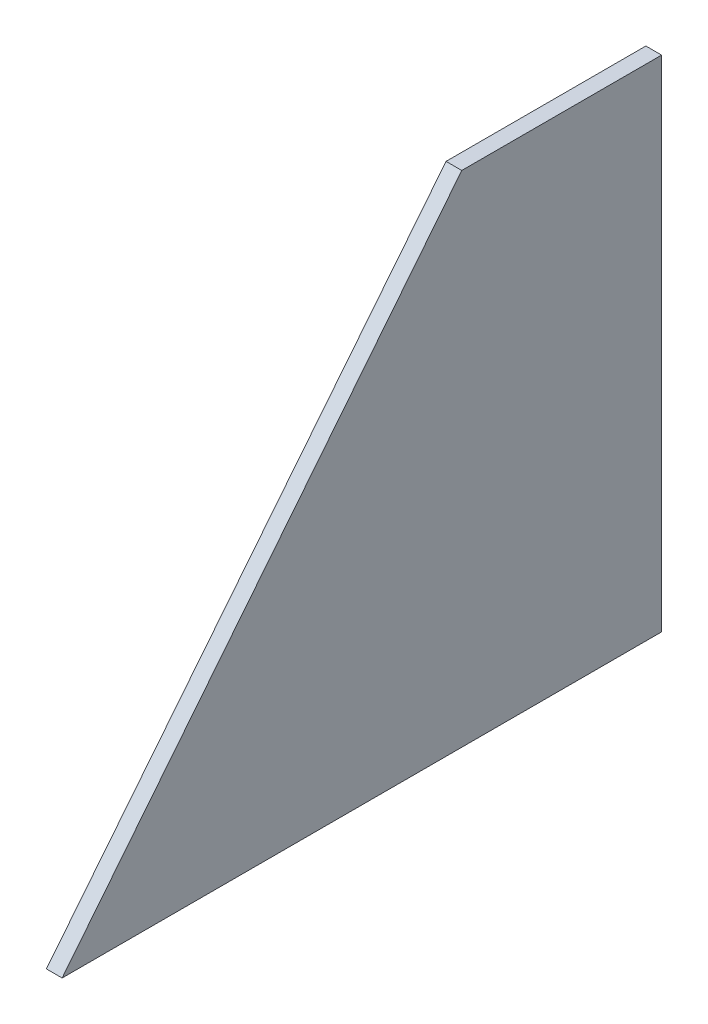
ISO-10303-21;
HEADER;
FILE_DESCRIPTION(('STEP AP214'),'2;1');
FILE_NAME('part.step','',(''),(''),'','','');
FILE_SCHEMA(('AUTOMOTIVE_DESIGN { 1 0 10303 214 1 1 1 1 }'));
ENDSEC;
DATA;
#1=APPLICATION_CONTEXT('core data for automotive mechanical design processes');
#2=APPLICATION_PROTOCOL_DEFINITION('international standard','automotive_design',2000,#1);
#3=PRODUCT_CONTEXT('',#1,'mechanical');
#4=PRODUCT('Part','Part','',(#3));
#5=PRODUCT_RELATED_PRODUCT_CATEGORY('part','',(#4));
#6=PRODUCT_DEFINITION_FORMATION('','',#4);
#7=PRODUCT_DEFINITION_CONTEXT('part definition',#1,'design');
#8=PRODUCT_DEFINITION('design','',#6,#7);
#9=PRODUCT_DEFINITION_SHAPE('','',#8);
#10=(LENGTH_UNIT() NAMED_UNIT(*) SI_UNIT(.MILLI.,.METRE.));
#11=(NAMED_UNIT(*) PLANE_ANGLE_UNIT() SI_UNIT($,.RADIAN.));
#12=(NAMED_UNIT(*) SI_UNIT($,.STERADIAN.) SOLID_ANGLE_UNIT());
#13=UNCERTAINTY_MEASURE_WITH_UNIT(LENGTH_MEASURE(1.E-05),#10,'distance_accuracy_value','');
#14=(GEOMETRIC_REPRESENTATION_CONTEXT(3) GLOBAL_UNCERTAINTY_ASSIGNED_CONTEXT((#13)) GLOBAL_UNIT_ASSIGNED_CONTEXT((#10,
#11,#12)) REPRESENTATION_CONTEXT('',''));
#15=CARTESIAN_POINT('',(0.,0.,0.));
#16=DIRECTION('',(0.,0.,1.));
#17=DIRECTION('',(1.,0.,0.));
#18=AXIS2_PLACEMENT_3D('',#15,#16,#17);
#19=CARTESIAN_POINT('',(6.,55.7560975609756,69.6951219512195));
#20=DIRECTION('',(0.,0.624695047554424,0.78086880944303));
#21=DIRECTION('',(0.,-0.78086880944303,0.624695047554424));
#22=AXIS2_PLACEMENT_3D('',#19,#20,#21);
#23=PLANE('',#22);
#24=DIRECTION('',(0.,0.78086880944303,-0.624695047554424));
#25=VECTOR('',#24,1.);
#26=CARTESIAN_POINT('',(0.,55.7560975609756,69.6951219512195));
#27=LINE('',#26,#25);
#28=CARTESIAN_POINT('',(0.,-95.25,190.5));
#29=VERTEX_POINT('',#28);
#30=CARTESIAN_POINT('',(0.,95.25,38.1));
#31=VERTEX_POINT('',#30);
#32=EDGE_CURVE('E99',#29,#31,#27,.T.);
#33=ORIENTED_EDGE('',*,*,#32,.F.);
#34=DIRECTION('',(-1.,0.,0.));
#35=VECTOR('',#34,1.);
#36=CARTESIAN_POINT('',(6.,-95.25,190.5));
#37=LINE('',#36,#35);
#38=CARTESIAN_POINT('',(6.,-95.25,190.5));
#39=VERTEX_POINT('',#38);
#40=EDGE_CURVE('E11',#39,#29,#37,.T.);
#41=ORIENTED_EDGE('',*,*,#40,.F.);
#42=DIRECTION('',(0.,0.78086880944303,-0.624695047554424));
#43=VECTOR('',#42,1.);
#44=CARTESIAN_POINT('',(6.,55.7560975609756,69.6951219512195));
#45=LINE('',#44,#43);
#46=CARTESIAN_POINT('',(6.,95.25,38.1));
#47=VERTEX_POINT('',#46);
#48=EDGE_CURVE('E93',#39,#47,#45,.T.);
#49=ORIENTED_EDGE('',*,*,#48,.T.);
#50=DIRECTION('',(-1.,0.,0.));
#51=VECTOR('',#50,1.);
#52=CARTESIAN_POINT('',(6.,95.25,38.1));
#53=LINE('',#52,#51);
#54=EDGE_CURVE('E51',#47,#31,#53,.T.);
#55=ORIENTED_EDGE('',*,*,#54,.T.);
#56=EDGE_LOOP('',(#33,#41,#49,#55));
#57=FACE_BOUND('',#56,.T.);
#58=ADVANCED_FACE('F35',(#57),#23,.T.);
#59=CARTESIAN_POINT('',(6.,-95.25,0.));
#60=DIRECTION('',(0.,-1.,0.));
#61=DIRECTION('',(0.,0.,-1.));
#62=AXIS2_PLACEMENT_3D('',#59,#60,#61);
#63=PLANE('',#62);
#64=DIRECTION('',(0.,0.,1.));
#65=VECTOR('',#64,1.);
#66=CARTESIAN_POINT('',(0.,-95.25,0.));
#67=LINE('',#66,#65);
#68=CARTESIAN_POINT('',(0.,-95.25,-38.1));
#69=VERTEX_POINT('',#68);
#70=EDGE_CURVE('E83',#69,#29,#67,.T.);
#71=ORIENTED_EDGE('',*,*,#70,.F.);
#72=DIRECTION('',(-1.,0.,0.));
#73=VECTOR('',#72,1.);
#74=CARTESIAN_POINT('',(6.,-95.25,-38.1));
#75=LINE('',#74,#73);
#76=CARTESIAN_POINT('',(6.,-95.25,-38.1));
#77=VERTEX_POINT('',#76);
#78=EDGE_CURVE('E43',#77,#69,#75,.T.);
#79=ORIENTED_EDGE('',*,*,#78,.F.);
#80=DIRECTION('',(0.,0.,1.));
#81=VECTOR('',#80,1.);
#82=CARTESIAN_POINT('',(6.,-95.25,0.));
#83=LINE('',#82,#81);
#84=EDGE_CURVE('E81',#77,#39,#83,.T.);
#85=ORIENTED_EDGE('',*,*,#84,.T.);
#86=ORIENTED_EDGE('',*,*,#40,.T.);
#87=EDGE_LOOP('',(#71,#79,#85,#86));
#88=FACE_BOUND('',#87,.T.);
#89=ADVANCED_FACE('F79',(#88),#63,.T.);
#90=CARTESIAN_POINT('',(6.,0.,-38.1));
#91=DIRECTION('',(0.,0.,1.));
#92=DIRECTION('',(1.,0.,0.));
#93=AXIS2_PLACEMENT_3D('',#90,#91,#92);
#94=PLANE('',#93);
#95=DIRECTION('',(0.,1.,0.));
#96=VECTOR('',#95,1.);
#97=CARTESIAN_POINT('',(0.,0.,-38.1));
#98=LINE('',#97,#96);
#99=CARTESIAN_POINT('',(0.,95.25,-38.1));
#100=VERTEX_POINT('',#99);
#101=EDGE_CURVE('E102',#69,#100,#98,.T.);
#102=ORIENTED_EDGE('',*,*,#101,.T.);
#103=DIRECTION('',(-1.,0.,0.));
#104=VECTOR('',#103,1.);
#105=CARTESIAN_POINT('',(6.,95.25,-38.1));
#106=LINE('',#105,#104);
#107=CARTESIAN_POINT('',(6.,95.25,-38.1));
#108=VERTEX_POINT('',#107);
#109=EDGE_CURVE('E65',#108,#100,#106,.T.);
#110=ORIENTED_EDGE('',*,*,#109,.F.);
#111=DIRECTION('',(0.,1.,0.));
#112=VECTOR('',#111,1.);
#113=CARTESIAN_POINT('',(6.,0.,-38.1));
#114=LINE('',#113,#112);
#115=EDGE_CURVE('E86',#77,#108,#114,.T.);
#116=ORIENTED_EDGE('',*,*,#115,.F.);
#117=ORIENTED_EDGE('',*,*,#78,.T.);
#118=EDGE_LOOP('',(#102,#110,#116,#117));
#119=FACE_BOUND('',#118,.T.);
#120=ADVANCED_FACE('F87',(#119),#94,.F.);
#121=CARTESIAN_POINT('',(6.,95.25,0.));
#122=DIRECTION('',(0.,1.,0.));
#123=DIRECTION('',(0.,0.,1.));
#124=AXIS2_PLACEMENT_3D('',#121,#122,#123);
#125=PLANE('',#124);
#126=DIRECTION('',(0.,0.,-1.));
#127=VECTOR('',#126,1.);
#128=CARTESIAN_POINT('',(0.,95.25,0.));
#129=LINE('',#128,#127);
#130=EDGE_CURVE('E95',#31,#100,#129,.T.);
#131=ORIENTED_EDGE('',*,*,#130,.F.);
#132=ORIENTED_EDGE('',*,*,#54,.F.);
#133=DIRECTION('',(0.,0.,-1.));
#134=VECTOR('',#133,1.);
#135=CARTESIAN_POINT('',(6.,95.25,0.));
#136=LINE('',#135,#134);
#137=EDGE_CURVE('E90',#47,#108,#136,.T.);
#138=ORIENTED_EDGE('',*,*,#137,.T.);
#139=ORIENTED_EDGE('',*,*,#109,.T.);
#140=EDGE_LOOP('',(#131,#132,#138,#139));
#141=FACE_BOUND('',#140,.T.);
#142=ADVANCED_FACE('F109',(#141),#125,.T.);
#143=CARTESIAN_POINT('',(6.,0.,0.));
#144=DIRECTION('',(1.,0.,0.));
#145=DIRECTION('',(0.,0.,-1.));
#146=AXIS2_PLACEMENT_3D('',#143,#144,#145);
#147=PLANE('',#146);
#148=ORIENTED_EDGE('',*,*,#48,.F.);
#149=ORIENTED_EDGE('',*,*,#84,.F.);
#150=ORIENTED_EDGE('',*,*,#115,.T.);
#151=ORIENTED_EDGE('',*,*,#137,.F.);
#152=EDGE_LOOP('',(#148,#149,#150,#151));
#153=FACE_BOUND('',#152,.T.);
#154=ADVANCED_FACE('F92',(#153),#147,.T.);
#155=CARTESIAN_POINT('',(0.,0.,0.));
#156=DIRECTION('',(1.,0.,0.));
#157=DIRECTION('',(0.,0.,-1.));
#158=AXIS2_PLACEMENT_3D('',#155,#156,#157);
#159=PLANE('',#158);
#160=ORIENTED_EDGE('',*,*,#32,.T.);
#161=ORIENTED_EDGE('',*,*,#130,.T.);
#162=ORIENTED_EDGE('',*,*,#101,.F.);
#163=ORIENTED_EDGE('',*,*,#70,.T.);
#164=EDGE_LOOP('',(#160,#161,#162,#163));
#165=FACE_BOUND('',#164,.T.);
#166=ADVANCED_FACE('F108',(#165),#159,.F.);
#167=CLOSED_SHELL('',(#58,#89,#120,#142,#154,#166));
#168=MANIFOLD_SOLID_BREP('B2',#167);
#169=ADVANCED_BREP_SHAPE_REPRESENTATION('',(#18,#168),#14);
#170=SHAPE_DEFINITION_REPRESENTATION(#9,#169);
ENDSEC;
END-ISO-10303-21;
